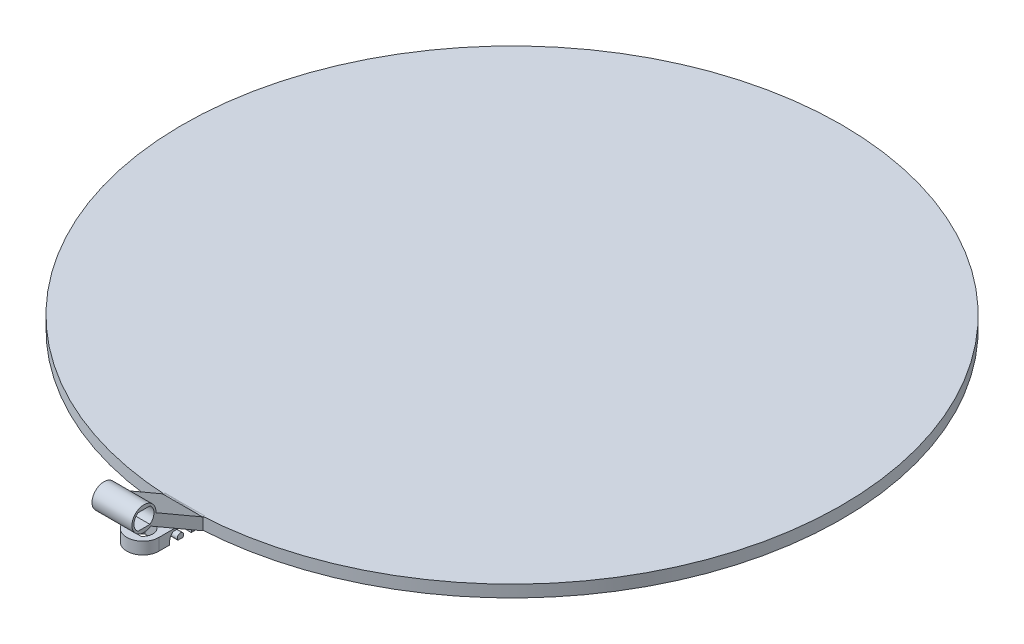
ISO-10303-21;
HEADER;
FILE_DESCRIPTION(('STEP AP214'),'2;1');
FILE_NAME('part.step','',(''),(''),'','','');
FILE_SCHEMA(('AUTOMOTIVE_DESIGN { 1 0 10303 214 1 1 1 1 }'));
ENDSEC;
DATA;
#1=APPLICATION_CONTEXT('core data for automotive mechanical design processes');
#2=APPLICATION_PROTOCOL_DEFINITION('international standard','automotive_design',2000,#1);
#3=PRODUCT_CONTEXT('',#1,'mechanical');
#4=PRODUCT('Part','Part','',(#3));
#5=PRODUCT_RELATED_PRODUCT_CATEGORY('part','',(#4));
#6=PRODUCT_DEFINITION_FORMATION('','',#4);
#7=PRODUCT_DEFINITION_CONTEXT('part definition',#1,'design');
#8=PRODUCT_DEFINITION('design','',#6,#7);
#9=PRODUCT_DEFINITION_SHAPE('','',#8);
#10=(LENGTH_UNIT() NAMED_UNIT(*) SI_UNIT(.MILLI.,.METRE.));
#11=(NAMED_UNIT(*) PLANE_ANGLE_UNIT() SI_UNIT($,.RADIAN.));
#12=(NAMED_UNIT(*) SI_UNIT($,.STERADIAN.) SOLID_ANGLE_UNIT());
#13=UNCERTAINTY_MEASURE_WITH_UNIT(LENGTH_MEASURE(1.E-05),#10,'distance_accuracy_value','');
#14=(GEOMETRIC_REPRESENTATION_CONTEXT(3) GLOBAL_UNCERTAINTY_ASSIGNED_CONTEXT((#13)) GLOBAL_UNIT_ASSIGNED_CONTEXT((#10,
#11,#12)) REPRESENTATION_CONTEXT('',''));
#15=CARTESIAN_POINT('',(0.,0.,0.));
#16=DIRECTION('',(0.,0.,1.));
#17=DIRECTION('',(1.,0.,0.));
#18=AXIS2_PLACEMENT_3D('',#15,#16,#17);
#19=CARTESIAN_POINT('',(5.,0.,0.));
#20=DIRECTION('',(1.,0.,0.));
#21=DIRECTION('',(0.,0.,-1.));
#22=AXIS2_PLACEMENT_3D('',#19,#20,#21);
#23=PLANE('',#22);
#24=DIRECTION('',(0.,0.5,0.866025403784439));
#25=VECTOR('',#24,1.);
#26=CARTESIAN_POINT('',(5.,-33.4735479061081,19.3259618943234));
#27=LINE('',#26,#25);
#28=CARTESIAN_POINT('',(5.,2.99999999999999,82.5));
#29=VERTEX_POINT('',#28);
#30=CARTESIAN_POINT('',(5.,9.72291827170098,94.1444360217193));
#31=VERTEX_POINT('',#30);
#32=EDGE_CURVE('E165',#29,#31,#27,.T.);
#33=ORIENTED_EDGE('',*,*,#32,.T.);
#34=CARTESIAN_POINT('',(5.,9.95,97.135829323957));
#35=DIRECTION('',(1.,0.,0.));
#36=DIRECTION('',(0.,0.,-1.));
#37=AXIS2_PLACEMENT_3D('',#34,#35,#36);
#38=CIRCLE('',#37,3.00000000000001);
#39=CARTESIAN_POINT('',(5.,7.472918271701,95.4434741273959));
#40=VERTEX_POINT('',#39);
#41=EDGE_CURVE('E109',#31,#40,#38,.T.);
#42=ORIENTED_EDGE('',*,*,#41,.T.);
#43=DIRECTION('',(0.,0.500000000000001,0.866025403784438));
#44=VECTOR('',#43,1.);
#45=CARTESIAN_POINT('',(5.,-35.7235479061081,20.6250000000001));
#46=LINE('',#45,#44);
#47=CARTESIAN_POINT('',(5.,0.,82.5));
#48=VERTEX_POINT('',#47);
#49=EDGE_CURVE('E142',#48,#40,#46,.T.);
#50=ORIENTED_EDGE('',*,*,#49,.F.);
#51=DIRECTION('',(0.,0.,1.));
#52=VECTOR('',#51,1.);
#53=CARTESIAN_POINT('',(5.,0.,0.));
#54=LINE('',#53,#52);
#55=CARTESIAN_POINT('',(5.,0.,82.0122848998968));
#56=VERTEX_POINT('',#55);
#57=EDGE_CURVE('E125',#56,#48,#54,.T.);
#58=ORIENTED_EDGE('',*,*,#57,.F.);
#59=DIRECTION('',(0.,-1.,0.));
#60=VECTOR('',#59,1.);
#61=CARTESIAN_POINT('',(5.,0.,82.0122848998968));
#62=LINE('',#61,#60);
#63=CARTESIAN_POINT('',(5.,3.,82.0122848998968));
#64=VERTEX_POINT('',#63);
#65=EDGE_CURVE('E140',#64,#56,#62,.T.);
#66=ORIENTED_EDGE('',*,*,#65,.F.);
#67=DIRECTION('',(0.,0.,-1.));
#68=VECTOR('',#67,1.);
#69=CARTESIAN_POINT('',(5.,3.,0.));
#70=LINE('',#69,#68);
#71=EDGE_CURVE('E145',#29,#64,#70,.T.);
#72=ORIENTED_EDGE('',*,*,#71,.F.);
#73=EDGE_LOOP('',(#33,#42,#50,#58,#66,#72));
#74=FACE_BOUND('',#73,.T.);
#75=CARTESIAN_POINT('',(5.,9.95,97.135829323957));
#76=DIRECTION('',(1.,0.,0.));
#77=DIRECTION('',(0.,0.,-1.));
#78=AXIS2_PLACEMENT_3D('',#75,#76,#77);
#79=CIRCLE('',#78,2.50000000000001);
#80=CARTESIAN_POINT('',(5.,11.95,98.635829323957));
#81=VERTEX_POINT('',#80);
#82=CARTESIAN_POINT('',(5.,7.95,98.635829323957));
#83=VERTEX_POINT('',#82);
#84=EDGE_CURVE('E320',#81,#83,#79,.T.);
#85=ORIENTED_EDGE('',*,*,#84,.F.);
#86=DIRECTION('',(0.,0.,-1.));
#87=VECTOR('',#86,1.);
#88=CARTESIAN_POINT('',(5.,11.95,0.));
#89=LINE('',#88,#87);
#90=CARTESIAN_POINT('',(5.,11.95,95.635829323957));
#91=VERTEX_POINT('',#90);
#92=EDGE_CURVE('E67',#81,#91,#89,.T.);
#93=ORIENTED_EDGE('',*,*,#92,.T.);
#94=CARTESIAN_POINT('',(5.,7.95,95.635829323957));
#95=VERTEX_POINT('',#94);
#96=EDGE_CURVE('E312',#95,#91,#79,.T.);
#97=ORIENTED_EDGE('',*,*,#96,.F.);
#98=DIRECTION('',(0.,0.,-1.));
#99=VECTOR('',#98,1.);
#100=CARTESIAN_POINT('',(5.,7.95,0.));
#101=LINE('',#100,#99);
#102=EDGE_CURVE('E323',#83,#95,#101,.T.);
#103=ORIENTED_EDGE('',*,*,#102,.F.);
#104=EDGE_LOOP('',(#85,#93,#97,#103));
#105=FACE_BOUND('',#104,.T.);
#106=ADVANCED_FACE('F51',(#74,#105),#23,.T.);
#107=CARTESIAN_POINT('',(5.,-33.4735479061081,19.3259618943234));
#108=DIRECTION('',(0.,-0.866025403784438,0.5));
#109=DIRECTION('',(0.,-0.5,-0.866025403784438));
#110=AXIS2_PLACEMENT_3D('',#107,#108,#109);
#111=PLANE('',#110);
#112=DIRECTION('',(0.,0.5,0.866025403784439));
#113=VECTOR('',#112,1.);
#114=CARTESIAN_POINT('',(-5.,-33.4735479061081,19.3259618943234));
#115=LINE('',#114,#113);
#116=CARTESIAN_POINT('',(-5.,2.99999999999999,82.5));
#117=VERTEX_POINT('',#116);
#118=CARTESIAN_POINT('',(-5.,9.72291827170098,94.1444360217193));
#119=VERTEX_POINT('',#118);
#120=EDGE_CURVE('E150',#117,#119,#115,.T.);
#121=ORIENTED_EDGE('',*,*,#120,.T.);
#122=DIRECTION('',(-1.,0.,0.));
#123=VECTOR('',#122,1.);
#124=CARTESIAN_POINT('',(5.,9.72291827170098,94.1444360217193));
#125=LINE('',#124,#123);
#126=EDGE_CURVE('E12',#31,#119,#125,.T.);
#127=ORIENTED_EDGE('',*,*,#126,.F.);
#128=ORIENTED_EDGE('',*,*,#32,.F.);
#129=DIRECTION('',(-1.,0.,0.));
#130=VECTOR('',#129,1.);
#131=CARTESIAN_POINT('',(5.,2.99999999999999,82.5));
#132=LINE('',#131,#130);
#133=EDGE_CURVE('E76',#29,#117,#132,.T.);
#134=ORIENTED_EDGE('',*,*,#133,.T.);
#135=EDGE_LOOP('',(#121,#127,#128,#134));
#136=FACE_BOUND('',#135,.T.);
#137=ADVANCED_FACE('F53',(#136),#111,.F.);
#138=CARTESIAN_POINT('',(5.,9.95,97.135829323957));
#139=DIRECTION('',(-1.,0.,0.));
#140=DIRECTION('',(0.,0.,1.));
#141=AXIS2_PLACEMENT_3D('',#138,#139,#140);
#142=CYLINDRICAL_SURFACE('',#141,3.00000000000001);
#143=CARTESIAN_POINT('',(-5.,9.95,97.135829323957));
#144=DIRECTION('',(1.,0.,0.));
#145=DIRECTION('',(0.,0.,-1.));
#146=AXIS2_PLACEMENT_3D('',#143,#144,#145);
#147=CIRCLE('',#146,3.00000000000001);
#148=CARTESIAN_POINT('',(-5.,7.472918271701,95.4434741273959));
#149=VERTEX_POINT('',#148);
#150=EDGE_CURVE('E152',#119,#149,#147,.T.);
#151=ORIENTED_EDGE('',*,*,#150,.T.);
#152=DIRECTION('',(-1.,0.,0.));
#153=VECTOR('',#152,1.);
#154=CARTESIAN_POINT('',(5.,7.472918271701,95.4434741273959));
#155=LINE('',#154,#153);
#156=EDGE_CURVE('E60',#40,#149,#155,.T.);
#157=ORIENTED_EDGE('',*,*,#156,.F.);
#158=ORIENTED_EDGE('',*,*,#41,.F.);
#159=ORIENTED_EDGE('',*,*,#126,.T.);
#160=EDGE_LOOP('',(#151,#157,#158,#159));
#161=FACE_BOUND('',#160,.T.);
#162=ADVANCED_FACE('F172',(#161),#142,.T.);
#163=CARTESIAN_POINT('',(5.,-35.7235479061081,20.6250000000001));
#164=DIRECTION('',(0.,-0.866025403784438,0.500000000000001));
#165=DIRECTION('',(0.,-0.500000000000001,-0.866025403784438));
#166=AXIS2_PLACEMENT_3D('',#163,#164,#165);
#167=PLANE('',#166);
#168=DIRECTION('',(0.,0.500000000000001,0.866025403784438));
#169=VECTOR('',#168,1.);
#170=CARTESIAN_POINT('',(-5.,-35.7235479061081,20.6250000000001));
#171=LINE('',#170,#169);
#172=CARTESIAN_POINT('',(-5.,0.,82.5));
#173=VERTEX_POINT('',#172);
#174=EDGE_CURVE('E156',#173,#149,#171,.T.);
#175=ORIENTED_EDGE('',*,*,#174,.F.);
#176=DIRECTION('',(-1.,0.,0.));
#177=VECTOR('',#176,1.);
#178=CARTESIAN_POINT('',(5.,0.,82.5));
#179=LINE('',#178,#177);
#180=EDGE_CURVE('E132',#48,#173,#179,.T.);
#181=ORIENTED_EDGE('',*,*,#180,.F.);
#182=ORIENTED_EDGE('',*,*,#49,.T.);
#183=ORIENTED_EDGE('',*,*,#156,.T.);
#184=EDGE_LOOP('',(#175,#181,#182,#183));
#185=FACE_BOUND('',#184,.T.);
#186=ADVANCED_FACE('F171',(#185),#167,.T.);
#187=CARTESIAN_POINT('',(5.,0.,0.));
#188=DIRECTION('',(0.,-1.,0.));
#189=DIRECTION('',(0.,0.,-1.));
#190=AXIS2_PLACEMENT_3D('',#187,#188,#189);
#191=PLANE('',#190);
#192=DIRECTION('',(0.,0.,1.));
#193=VECTOR('',#192,1.);
#194=CARTESIAN_POINT('',(-5.,0.,0.));
#195=LINE('',#194,#193);
#196=CARTESIAN_POINT('',(-5.,0.,82.0122848998968));
#197=VERTEX_POINT('',#196);
#198=EDGE_CURVE('E127',#197,#173,#195,.T.);
#199=ORIENTED_EDGE('',*,*,#198,.F.);
#200=DIRECTION('',(-1.,0.,0.));
#201=VECTOR('',#200,1.);
#202=CARTESIAN_POINT('',(5.,0.,82.0122848998968));
#203=LINE('',#202,#201);
#204=EDGE_CURVE('E122',#56,#197,#203,.T.);
#205=ORIENTED_EDGE('',*,*,#204,.F.);
#206=ORIENTED_EDGE('',*,*,#57,.T.);
#207=ORIENTED_EDGE('',*,*,#180,.T.);
#208=EDGE_LOOP('',(#199,#205,#206,#207));
#209=FACE_BOUND('',#208,.T.);
#210=ADVANCED_FACE('F124',(#209),#191,.T.);
#211=CARTESIAN_POINT('',(5.,0.,82.0122848998968));
#212=DIRECTION('',(0.,0.,-1.));
#213=DIRECTION('',(-1.,0.,0.));
#214=AXIS2_PLACEMENT_3D('',#211,#212,#213);
#215=PLANE('',#214);
#216=DIRECTION('',(0.,-1.,0.));
#217=VECTOR('',#216,1.);
#218=CARTESIAN_POINT('',(-5.,0.,82.0122848998968));
#219=LINE('',#218,#217);
#220=CARTESIAN_POINT('',(-5.,3.,82.0122848998968));
#221=VERTEX_POINT('',#220);
#222=EDGE_CURVE('E160',#221,#197,#219,.T.);
#223=ORIENTED_EDGE('',*,*,#222,.F.);
#224=DIRECTION('',(-1.,0.,0.));
#225=VECTOR('',#224,1.);
#226=CARTESIAN_POINT('',(5.,3.,82.0122848998968));
#227=LINE('',#226,#225);
#228=EDGE_CURVE('E133',#64,#221,#227,.T.);
#229=ORIENTED_EDGE('',*,*,#228,.F.);
#230=ORIENTED_EDGE('',*,*,#65,.T.);
#231=ORIENTED_EDGE('',*,*,#204,.T.);
#232=EDGE_LOOP('',(#223,#229,#230,#231));
#233=FACE_BOUND('',#232,.T.);
#234=ADVANCED_FACE('F144',(#233),#215,.T.);
#235=CARTESIAN_POINT('',(5.,3.,0.));
#236=DIRECTION('',(0.,1.,0.));
#237=DIRECTION('',(0.,0.,1.));
#238=AXIS2_PLACEMENT_3D('',#235,#236,#237);
#239=PLANE('',#238);
#240=DIRECTION('',(0.,0.,-1.));
#241=VECTOR('',#240,1.);
#242=CARTESIAN_POINT('',(-5.,3.,0.));
#243=LINE('',#242,#241);
#244=EDGE_CURVE('E162',#117,#221,#243,.T.);
#245=ORIENTED_EDGE('',*,*,#244,.F.);
#246=ORIENTED_EDGE('',*,*,#133,.F.);
#247=ORIENTED_EDGE('',*,*,#71,.T.);
#248=ORIENTED_EDGE('',*,*,#228,.T.);
#249=EDGE_LOOP('',(#245,#246,#247,#248));
#250=FACE_BOUND('',#249,.T.);
#251=ADVANCED_FACE('F176',(#250),#239,.T.);
#252=CARTESIAN_POINT('',(-5.,0.,0.));
#253=DIRECTION('',(1.,0.,0.));
#254=DIRECTION('',(0.,0.,-1.));
#255=AXIS2_PLACEMENT_3D('',#252,#253,#254);
#256=PLANE('',#255);
#257=ORIENTED_EDGE('',*,*,#120,.F.);
#258=ORIENTED_EDGE('',*,*,#244,.T.);
#259=ORIENTED_EDGE('',*,*,#222,.T.);
#260=ORIENTED_EDGE('',*,*,#198,.T.);
#261=ORIENTED_EDGE('',*,*,#174,.T.);
#262=ORIENTED_EDGE('',*,*,#150,.F.);
#263=EDGE_LOOP('',(#257,#258,#259,#260,#261,#262));
#264=FACE_BOUND('',#263,.T.);
#265=ADVANCED_FACE('F175',(#264),#256,.F.);
#266=CARTESIAN_POINT('',(-3.,11.95,0.));
#267=DIRECTION('',(0.,-1.,0.));
#268=DIRECTION('',(0.,0.,-1.));
#269=AXIS2_PLACEMENT_3D('',#266,#267,#268);
#270=PLANE('',#269);
#271=ORIENTED_EDGE('',*,*,#92,.F.);
#272=DIRECTION('',(1.,0.,0.));
#273=VECTOR('',#272,1.);
#274=CARTESIAN_POINT('',(-3.,11.95,98.635829323957));
#275=LINE('',#274,#273);
#276=CARTESIAN_POINT('',(-3.,11.95,98.635829323957));
#277=VERTEX_POINT('',#276);
#278=EDGE_CURVE('E333',#277,#81,#275,.T.);
#279=ORIENTED_EDGE('',*,*,#278,.F.);
#280=DIRECTION('',(0.,0.,-1.));
#281=VECTOR('',#280,1.);
#282=CARTESIAN_POINT('',(-3.,11.95,0.));
#283=LINE('',#282,#281);
#284=CARTESIAN_POINT('',(-3.,11.95,95.635829323957));
#285=VERTEX_POINT('',#284);
#286=EDGE_CURVE('E308',#277,#285,#283,.T.);
#287=ORIENTED_EDGE('',*,*,#286,.T.);
#288=DIRECTION('',(1.,0.,0.));
#289=VECTOR('',#288,1.);
#290=CARTESIAN_POINT('',(-3.,11.95,95.635829323957));
#291=LINE('',#290,#289);
#292=EDGE_CURVE('E153',#285,#91,#291,.T.);
#293=ORIENTED_EDGE('',*,*,#292,.T.);
#294=EDGE_LOOP('',(#271,#279,#287,#293));
#295=FACE_BOUND('',#294,.T.);
#296=ADVANCED_FACE('F190',(#295),#270,.T.);
#297=CARTESIAN_POINT('',(-3.,9.95,97.135829323957));
#298=DIRECTION('',(1.,0.,0.));
#299=DIRECTION('',(0.,0.,-1.));
#300=AXIS2_PLACEMENT_3D('',#297,#298,#299);
#301=CYLINDRICAL_SURFACE('',#300,2.50000000000001);
#302=ORIENTED_EDGE('',*,*,#96,.T.);
#303=ORIENTED_EDGE('',*,*,#292,.F.);
#304=CARTESIAN_POINT('',(-3.,9.95,97.135829323957));
#305=DIRECTION('',(1.,0.,0.));
#306=DIRECTION('',(0.,0.,-1.));
#307=AXIS2_PLACEMENT_3D('',#304,#305,#306);
#308=CIRCLE('',#307,2.50000000000001);
#309=CARTESIAN_POINT('',(-3.,7.95,95.635829323957));
#310=VERTEX_POINT('',#309);
#311=EDGE_CURVE('E316',#310,#285,#308,.T.);
#312=ORIENTED_EDGE('',*,*,#311,.F.);
#313=DIRECTION('',(1.,0.,0.));
#314=VECTOR('',#313,1.);
#315=CARTESIAN_POINT('',(-3.,7.95,95.635829323957));
#316=LINE('',#315,#314);
#317=EDGE_CURVE('E327',#310,#95,#316,.T.);
#318=ORIENTED_EDGE('',*,*,#317,.T.);
#319=EDGE_LOOP('',(#302,#303,#312,#318));
#320=FACE_BOUND('',#319,.T.);
#321=ADVANCED_FACE('F242',(#320),#301,.F.);
#322=CARTESIAN_POINT('',(-3.,7.95,0.));
#323=DIRECTION('',(0.,-1.,0.));
#324=DIRECTION('',(0.,0.,-1.));
#325=AXIS2_PLACEMENT_3D('',#322,#323,#324);
#326=PLANE('',#325);
#327=ORIENTED_EDGE('',*,*,#102,.T.);
#328=ORIENTED_EDGE('',*,*,#317,.F.);
#329=DIRECTION('',(0.,0.,-1.));
#330=VECTOR('',#329,1.);
#331=CARTESIAN_POINT('',(-3.,7.95,0.));
#332=LINE('',#331,#330);
#333=CARTESIAN_POINT('',(-3.,7.95,98.635829323957));
#334=VERTEX_POINT('',#333);
#335=EDGE_CURVE('E315',#334,#310,#332,.T.);
#336=ORIENTED_EDGE('',*,*,#335,.F.);
#337=DIRECTION('',(1.,0.,0.));
#338=VECTOR('',#337,1.);
#339=CARTESIAN_POINT('',(-3.,7.95,98.635829323957));
#340=LINE('',#339,#338);
#341=EDGE_CURVE('E330',#334,#83,#340,.T.);
#342=ORIENTED_EDGE('',*,*,#341,.T.);
#343=EDGE_LOOP('',(#327,#328,#336,#342));
#344=FACE_BOUND('',#343,.T.);
#345=ADVANCED_FACE('F250',(#344),#326,.F.);
#346=ORIENTED_EDGE('',*,*,#84,.T.);
#347=ORIENTED_EDGE('',*,*,#341,.F.);
#348=EDGE_CURVE('E311',#277,#334,#308,.T.);
#349=ORIENTED_EDGE('',*,*,#348,.F.);
#350=ORIENTED_EDGE('',*,*,#278,.T.);
#351=EDGE_LOOP('',(#346,#347,#349,#350));
#352=FACE_BOUND('',#351,.T.);
#353=ADVANCED_FACE('F253',(#352),#301,.F.);
#354=CARTESIAN_POINT('',(-3.,0.,0.));
#355=DIRECTION('',(1.,0.,0.));
#356=DIRECTION('',(0.,0.,-1.));
#357=AXIS2_PLACEMENT_3D('',#354,#355,#356);
#358=PLANE('',#357);
#359=CARTESIAN_POINT('',(-3.,9.95,97.135829323957));
#360=DIRECTION('',(1.,0.,0.));
#361=DIRECTION('',(0.,0.,-1.));
#362=AXIS2_PLACEMENT_3D('',#359,#360,#361);
#363=CIRCLE('',#362,0.999999999999998);
#364=CARTESIAN_POINT('',(-3.,9.95,96.135829323957));
#365=VERTEX_POINT('',#364);
#366=EDGE_CURVE('E55',#365,#365,#363,.F.);
#367=ORIENTED_EDGE('',*,*,#366,.T.);
#368=EDGE_LOOP('',(#367));
#369=FACE_BOUND('',#368,.T.);
#370=ORIENTED_EDGE('',*,*,#286,.F.);
#371=ORIENTED_EDGE('',*,*,#348,.T.);
#372=ORIENTED_EDGE('',*,*,#335,.T.);
#373=ORIENTED_EDGE('',*,*,#311,.T.);
#374=EDGE_LOOP('',(#370,#371,#372,#373));
#375=FACE_BOUND('',#374,.T.);
#376=ADVANCED_FACE('F269',(#369,#375),#358,.T.);
#377=CARTESIAN_POINT('',(-2.,9.95,97.135829323957));
#378=DIRECTION('',(-1.,0.,0.));
#379=DIRECTION('',(0.,0.,1.));
#380=AXIS2_PLACEMENT_3D('',#377,#378,#379);
#381=CYLINDRICAL_SURFACE('',#380,0.999999999999998);
#382=ORIENTED_EDGE('',*,*,#366,.F.);
#383=EDGE_LOOP('',(#382));
#384=FACE_BOUND('',#383,.T.);
#385=CARTESIAN_POINT('',(-2.,9.95,97.135829323957));
#386=DIRECTION('',(1.,0.,0.));
#387=DIRECTION('',(0.,0.,-1.));
#388=AXIS2_PLACEMENT_3D('',#385,#386,#387);
#389=CIRCLE('',#388,0.999999999999998);
#390=CARTESIAN_POINT('',(-2.,9.95,96.135829323957));
#391=VERTEX_POINT('',#390);
#392=EDGE_CURVE('E303',#391,#391,#389,.T.);
#393=ORIENTED_EDGE('',*,*,#392,.F.);
#394=EDGE_LOOP('',(#393));
#395=FACE_BOUND('',#394,.T.);
#396=ADVANCED_FACE('F278',(#384,#395),#381,.T.);
#397=CARTESIAN_POINT('',(-2.,9.95,97.135829323957));
#398=DIRECTION('',(1.,0.,0.));
#399=DIRECTION('',(0.,0.,-1.));
#400=AXIS2_PLACEMENT_3D('',#397,#398,#399);
#401=PLANE('',#400);
#402=ORIENTED_EDGE('',*,*,#392,.T.);
#403=EDGE_LOOP('',(#402));
#404=FACE_BOUND('',#403,.T.);
#405=ADVANCED_FACE('F288',(#404),#401,.T.);
#406=CLOSED_SHELL('',(#106,#137,#162,#186,#210,#234,#251,#265,#296,#321,#345,#353,#376,#396,#405));
#407=MANIFOLD_SOLID_BREP('B2',#406);
#408=CARTESIAN_POINT('',(0.,0.,0.));
#409=DIRECTION('',(0.,1.,0.));
#410=DIRECTION('',(0.,0.,1.));
#411=AXIS2_PLACEMENT_3D('',#408,#409,#410);
#412=PLANE('',#411);
#413=DIRECTION('',(-1.,0.,0.));
#414=VECTOR('',#413,1.);
#415=CARTESIAN_POINT('',(0.,0.,90.4029732473289));
#416=LINE('',#415,#414);
#417=CARTESIAN_POINT('',(1.50000000000002,0.,90.4029732473289));
#418=VERTEX_POINT('',#417);
#419=CARTESIAN_POINT('',(-1.50000000000002,0.,90.4029732473289));
#420=VERTEX_POINT('',#419);
#421=EDGE_CURVE('E556',#418,#420,#416,.T.);
#422=ORIENTED_EDGE('',*,*,#421,.T.);
#423=CARTESIAN_POINT('',(0.,0.,92.4029732473289));
#424=DIRECTION('',(0.,1.,0.));
#425=DIRECTION('',(0.,0.,1.));
#426=AXIS2_PLACEMENT_3D('',#423,#424,#425);
#427=CIRCLE('',#426,2.5);
#428=CARTESIAN_POINT('',(-1.5,0.,94.4029732473289));
#429=VERTEX_POINT('',#428);
#430=EDGE_CURVE('E566',#429,#420,#427,.F.);
#431=ORIENTED_EDGE('',*,*,#430,.F.);
#432=DIRECTION('',(-1.,0.,0.));
#433=VECTOR('',#432,1.);
#434=CARTESIAN_POINT('',(0.,0.,94.4029732473289));
#435=LINE('',#434,#433);
#436=CARTESIAN_POINT('',(1.5,0.,94.4029732473289));
#437=VERTEX_POINT('',#436);
#438=EDGE_CURVE('E570',#437,#429,#435,.T.);
#439=ORIENTED_EDGE('',*,*,#438,.F.);
#440=CARTESIAN_POINT('',(0.,0.,92.4029732473289));
#441=DIRECTION('',(0.,1.,0.));
#442=DIRECTION('',(0.,0.,1.));
#443=AXIS2_PLACEMENT_3D('',#440,#441,#442);
#444=CIRCLE('',#443,2.5);
#445=EDGE_CURVE('E531',#418,#437,#444,.F.);
#446=ORIENTED_EDGE('',*,*,#445,.F.);
#447=EDGE_LOOP('',(#422,#431,#439,#446));
#448=FACE_BOUND('',#447,.T.);
#449=DIRECTION('',(1.,0.,0.));
#450=VECTOR('',#449,1.);
#451=CARTESIAN_POINT('',(-10.,0.,88.4142135623731));
#452=LINE('',#451,#450);
#453=CARTESIAN_POINT('',(-2.,0.,88.4142135623731));
#454=VERTEX_POINT('',#453);
#455=CARTESIAN_POINT('',(-4.,0.,88.4142135623731));
#456=VERTEX_POINT('',#455);
#457=EDGE_CURVE('E390',#454,#456,#452,.F.);
#458=ORIENTED_EDGE('',*,*,#457,.F.);
#459=DIRECTION('',(0.,0.,1.));
#460=VECTOR('',#459,1.);
#461=CARTESIAN_POINT('',(-2.,0.,0.));
#462=LINE('',#461,#460);
#463=CARTESIAN_POINT('',(-2.,0.,85.5857864376269));
#464=VERTEX_POINT('',#463);
#465=EDGE_CURVE('E49',#464,#454,#462,.T.);
#466=ORIENTED_EDGE('',*,*,#465,.F.);
#467=DIRECTION('',(1.,0.,0.));
#468=VECTOR('',#467,1.);
#469=CARTESIAN_POINT('',(-10.,0.,85.5857864376269));
#470=LINE('',#469,#468);
#471=CARTESIAN_POINT('',(-4.,0.,85.5857864376269));
#472=VERTEX_POINT('',#471);
#473=EDGE_CURVE('E486',#472,#464,#470,.T.);
#474=ORIENTED_EDGE('',*,*,#473,.F.);
#475=DIRECTION('',(0.,0.,-1.));
#476=VECTOR('',#475,1.);
#477=CARTESIAN_POINT('',(-4.,0.,0.));
#478=LINE('',#477,#476);
#479=CARTESIAN_POINT('',(-4.00000000000016,0.,82.4029732473289));
#480=VERTEX_POINT('',#479);
#481=EDGE_CURVE('E536',#472,#480,#478,.T.);
#482=ORIENTED_EDGE('',*,*,#481,.T.);
#483=CARTESIAN_POINT('',(0.,0.,0.));
#484=DIRECTION('',(0.,1.,0.));
#485=DIRECTION('',(0.,0.,1.));
#486=AXIS2_PLACEMENT_3D('',#483,#484,#485);
#487=CIRCLE('',#486,82.5);
#488=CARTESIAN_POINT('',(4.,0.,82.4029732473289));
#489=VERTEX_POINT('',#488);
#490=EDGE_CURVE('E575',#489,#480,#487,.T.);
#491=ORIENTED_EDGE('',*,*,#490,.F.);
#492=DIRECTION('',(0.,0.,-1.));
#493=VECTOR('',#492,1.);
#494=CARTESIAN_POINT('',(4.,0.,0.));
#495=LINE('',#494,#493);
#496=CARTESIAN_POINT('',(4.,0.,84.295836543402));
#497=VERTEX_POINT('',#496);
#498=EDGE_CURVE('E559',#497,#489,#495,.T.);
#499=ORIENTED_EDGE('',*,*,#498,.F.);
#500=DIRECTION('',(1.,0.,0.));
#501=VECTOR('',#500,1.);
#502=CARTESIAN_POINT('',(0.,0.,84.295836543402));
#503=LINE('',#502,#501);
#504=CARTESIAN_POINT('',(0.,0.,84.295836543402));
#505=VERTEX_POINT('',#504);
#506=EDGE_CURVE('E524',#497,#505,#503,.F.);
#507=ORIENTED_EDGE('',*,*,#506,.T.);
#508=DIRECTION('',(0.,0.,-1.));
#509=VECTOR('',#508,1.);
#510=CARTESIAN_POINT('',(0.,0.,0.));
#511=LINE('',#510,#509);
#512=CARTESIAN_POINT('',(0.,0.,86.3755002001602));
#513=VERTEX_POINT('',#512);
#514=EDGE_CURVE('E599',#513,#505,#511,.T.);
#515=ORIENTED_EDGE('',*,*,#514,.F.);
#516=DIRECTION('',(1.,0.,0.));
#517=VECTOR('',#516,1.);
#518=CARTESIAN_POINT('',(0.,0.,86.3755002001602));
#519=LINE('',#518,#517);
#520=CARTESIAN_POINT('',(4.,0.,86.3755002001602));
#521=VERTEX_POINT('',#520);
#522=EDGE_CURVE('E520',#521,#513,#519,.F.);
#523=ORIENTED_EDGE('',*,*,#522,.F.);
#524=CARTESIAN_POINT('',(4.,0.,87.6244997998398));
#525=VERTEX_POINT('',#524);
#526=EDGE_CURVE('E583',#525,#521,#495,.T.);
#527=ORIENTED_EDGE('',*,*,#526,.F.);
#528=DIRECTION('',(1.,0.,0.));
#529=VECTOR('',#528,1.);
#530=CARTESIAN_POINT('',(0.,0.,87.6244997998398));
#531=LINE('',#530,#529);
#532=CARTESIAN_POINT('',(0.,0.,87.6244997998398));
#533=VERTEX_POINT('',#532);
#534=EDGE_CURVE('E522',#533,#525,#531,.T.);
#535=ORIENTED_EDGE('',*,*,#534,.F.);
#536=CARTESIAN_POINT('',(0.,0.,89.704163456598));
#537=VERTEX_POINT('',#536);
#538=EDGE_CURVE('E600',#537,#533,#511,.T.);
#539=ORIENTED_EDGE('',*,*,#538,.F.);
#540=DIRECTION('',(1.,0.,0.));
#541=VECTOR('',#540,1.);
#542=CARTESIAN_POINT('',(0.,0.,89.704163456598));
#543=LINE('',#542,#541);
#544=CARTESIAN_POINT('',(4.,0.,89.704163456598));
#545=VERTEX_POINT('',#544);
#546=EDGE_CURVE('E516',#537,#545,#543,.T.);
#547=ORIENTED_EDGE('',*,*,#546,.T.);
#548=CARTESIAN_POINT('',(4.,0.,92.4029732473289));
#549=VERTEX_POINT('',#548);
#550=EDGE_CURVE('E562',#549,#545,#495,.T.);
#551=ORIENTED_EDGE('',*,*,#550,.F.);
#552=CARTESIAN_POINT('',(0.,0.,92.4029732473289));
#553=DIRECTION('',(0.,1.,0.));
#554=DIRECTION('',(0.,0.,1.));
#555=AXIS2_PLACEMENT_3D('',#552,#553,#554);
#556=CIRCLE('',#555,4.);
#557=CARTESIAN_POINT('',(-4.,0.,92.4029732473289));
#558=VERTEX_POINT('',#557);
#559=EDGE_CURVE('E554',#549,#558,#556,.F.);
#560=ORIENTED_EDGE('',*,*,#559,.T.);
#561=EDGE_CURVE('E500',#558,#456,#478,.T.);
#562=ORIENTED_EDGE('',*,*,#561,.T.);
#563=EDGE_LOOP('',(#458,#466,#474,#482,#491,#499,#507,#515,#523,#527,#535,#539,#547,#551,#560,#562));
#564=FACE_BOUND('',#563,.T.);
#565=ADVANCED_FACE('F375',(#448,#564),#412,.F.);
#566=CARTESIAN_POINT('',(4.,-16.1245154965973,0.));
#567=DIRECTION('',(-1.,0.,0.));
#568=DIRECTION('',(0.,0.,1.));
#569=AXIS2_PLACEMENT_3D('',#566,#567,#568);
#570=PLANE('',#569);
#571=CARTESIAN_POINT('',(4.,0.5,87.));
#572=DIRECTION('',(-1.,0.,0.));
#573=DIRECTION('',(0.,0.,1.));
#574=AXIS2_PLACEMENT_3D('',#571,#572,#573);
#575=CIRCLE('',#574,0.799999999999995);
#576=EDGE_CURVE('E597',#525,#521,#575,.T.);
#577=ORIENTED_EDGE('',*,*,#576,.F.);
#578=ORIENTED_EDGE('',*,*,#526,.T.);
#579=EDGE_LOOP('',(#577,#578));
#580=FACE_BOUND('',#579,.T.);
#581=ADVANCED_FACE('F652',(#580),#570,.F.);
#582=CARTESIAN_POINT('',(0.,3.,0.));
#583=DIRECTION('',(0.,-1.,0.));
#584=DIRECTION('',(0.,0.,-1.));
#585=AXIS2_PLACEMENT_3D('',#582,#583,#584);
#586=CYLINDRICAL_SURFACE('',#585,82.5);
#587=ORIENTED_EDGE('',*,*,#490,.T.);
#588=DIRECTION('',(0.,1.,0.));
#589=VECTOR('',#588,1.);
#590=CARTESIAN_POINT('',(-4.00000000000016,-16.1245154965973,82.4029732473289));
#591=LINE('',#590,#589);
#592=CARTESIAN_POINT('',(-4.00000000000016,3.,82.4029732473289));
#593=VERTEX_POINT('',#592);
#594=EDGE_CURVE('E557',#480,#593,#591,.T.);
#595=ORIENTED_EDGE('',*,*,#594,.T.);
#596=CARTESIAN_POINT('',(0.,3.,0.));
#597=DIRECTION('',(0.,1.,0.));
#598=DIRECTION('',(0.,0.,1.));
#599=AXIS2_PLACEMENT_3D('',#596,#597,#598);
#600=CIRCLE('',#599,82.5);
#601=CARTESIAN_POINT('',(4.,3.,82.4029732473289));
#602=VERTEX_POINT('',#601);
#603=EDGE_CURVE('E584',#602,#593,#600,.T.);
#604=ORIENTED_EDGE('',*,*,#603,.F.);
#605=DIRECTION('',(0.,1.,0.));
#606=VECTOR('',#605,1.);
#607=CARTESIAN_POINT('',(4.00000000000016,-16.1245154965973,82.4029732473289));
#608=LINE('',#607,#606);
#609=EDGE_CURVE('E532',#489,#602,#608,.T.);
#610=ORIENTED_EDGE('',*,*,#609,.F.);
#611=EDGE_LOOP('',(#587,#595,#604,#610));
#612=FACE_BOUND('',#611,.T.);
#613=ADVANCED_FACE('F377',(#612),#586,.T.);
#614=CARTESIAN_POINT('',(0.,3.,0.));
#615=DIRECTION('',(0.,1.,0.));
#616=DIRECTION('',(0.,0.,1.));
#617=AXIS2_PLACEMENT_3D('',#614,#615,#616);
#618=PLANE('',#617);
#619=ORIENTED_EDGE('',*,*,#603,.T.);
#620=DIRECTION('',(0.,0.,1.));
#621=VECTOR('',#620,1.);
#622=CARTESIAN_POINT('',(-4.,3.,0.));
#623=LINE('',#622,#621);
#624=CARTESIAN_POINT('',(-4.,3.,92.4029732473289));
#625=VERTEX_POINT('',#624);
#626=EDGE_CURVE('E537',#593,#625,#623,.T.);
#627=ORIENTED_EDGE('',*,*,#626,.T.);
#628=CARTESIAN_POINT('',(0.,3.,92.4029732473289));
#629=DIRECTION('',(0.,1.,0.));
#630=DIRECTION('',(0.,0.,1.));
#631=AXIS2_PLACEMENT_3D('',#628,#629,#630);
#632=CIRCLE('',#631,4.);
#633=CARTESIAN_POINT('',(4.,3.,92.4029732473289));
#634=VERTEX_POINT('',#633);
#635=EDGE_CURVE('E533',#625,#634,#632,.T.);
#636=ORIENTED_EDGE('',*,*,#635,.T.);
#637=DIRECTION('',(0.,0.,1.));
#638=VECTOR('',#637,1.);
#639=CARTESIAN_POINT('',(4.,3.,0.));
#640=LINE('',#639,#638);
#641=EDGE_CURVE('E528',#602,#634,#640,.T.);
#642=ORIENTED_EDGE('',*,*,#641,.F.);
#643=EDGE_LOOP('',(#619,#627,#636,#642));
#644=FACE_BOUND('',#643,.T.);
#645=CARTESIAN_POINT('',(0.,3.,92.4029732473289));
#646=DIRECTION('',(0.,1.,0.));
#647=DIRECTION('',(0.,0.,1.));
#648=AXIS2_PLACEMENT_3D('',#645,#646,#647);
#649=CIRCLE('',#648,2.5);
#650=CARTESIAN_POINT('',(1.5,3.,94.4029732473289));
#651=VERTEX_POINT('',#650);
#652=CARTESIAN_POINT('',(1.50000000000002,3.,90.4029732473289));
#653=VERTEX_POINT('',#652);
#654=EDGE_CURVE('E548',#651,#653,#649,.T.);
#655=ORIENTED_EDGE('',*,*,#654,.F.);
#656=DIRECTION('',(1.,0.,0.));
#657=VECTOR('',#656,1.);
#658=CARTESIAN_POINT('',(0.,3.,94.4029732473289));
#659=LINE('',#658,#657);
#660=CARTESIAN_POINT('',(-1.5,3.,94.4029732473289));
#661=VERTEX_POINT('',#660);
#662=EDGE_CURVE('E544',#661,#651,#659,.T.);
#663=ORIENTED_EDGE('',*,*,#662,.F.);
#664=CARTESIAN_POINT('',(-1.50000000000002,3.,90.4029732473289));
#665=VERTEX_POINT('',#664);
#666=EDGE_CURVE('E553',#665,#661,#649,.T.);
#667=ORIENTED_EDGE('',*,*,#666,.F.);
#668=DIRECTION('',(1.,0.,0.));
#669=VECTOR('',#668,1.);
#670=CARTESIAN_POINT('',(0.,3.,90.4029732473289));
#671=LINE('',#670,#669);
#672=EDGE_CURVE('E540',#665,#653,#671,.T.);
#673=ORIENTED_EDGE('',*,*,#672,.T.);
#674=EDGE_LOOP('',(#655,#663,#667,#673));
#675=FACE_BOUND('',#674,.T.);
#676=ADVANCED_FACE('F627',(#644,#675),#618,.T.);
#677=CARTESIAN_POINT('',(-4.,-16.1245154965973,0.));
#678=DIRECTION('',(-1.,0.,0.));
#679=DIRECTION('',(0.,0.,1.));
#680=AXIS2_PLACEMENT_3D('',#677,#678,#679);
#681=PLANE('',#680);
#682=ORIENTED_EDGE('',*,*,#481,.F.);
#683=CARTESIAN_POINT('',(-4.,0.5,87.));
#684=DIRECTION('',(-1.,0.,0.));
#685=DIRECTION('',(0.,0.,1.));
#686=AXIS2_PLACEMENT_3D('',#683,#684,#685);
#687=CIRCLE('',#686,1.5);
#688=EDGE_CURVE('E383',#472,#456,#687,.F.);
#689=ORIENTED_EDGE('',*,*,#688,.T.);
#690=ORIENTED_EDGE('',*,*,#561,.F.);
#691=DIRECTION('',(0.,1.,0.));
#692=VECTOR('',#691,1.);
#693=CARTESIAN_POINT('',(-4.,-16.1245154965973,92.4029732473289));
#694=LINE('',#693,#692);
#695=EDGE_CURVE('E527',#558,#625,#694,.T.);
#696=ORIENTED_EDGE('',*,*,#695,.T.);
#697=ORIENTED_EDGE('',*,*,#626,.F.);
#698=ORIENTED_EDGE('',*,*,#594,.F.);
#699=EDGE_LOOP('',(#682,#689,#690,#696,#697,#698));
#700=FACE_BOUND('',#699,.T.);
#701=ADVANCED_FACE('F629',(#700),#681,.T.);
#702=DIRECTION('',(0.,0.,1.));
#703=VECTOR('',#702,1.);
#704=CARTESIAN_POINT('',(4.,2.50000000000001,0.));
#705=LINE('',#704,#703);
#706=CARTESIAN_POINT('',(4.,2.5,85.1125413911823));
#707=VERTEX_POINT('',#706);
#708=CARTESIAN_POINT('',(4.,2.50000000000001,88.8874586088177));
#709=VERTEX_POINT('',#708);
#710=EDGE_CURVE('E592',#707,#709,#705,.T.);
#711=ORIENTED_EDGE('',*,*,#710,.F.);
#712=CARTESIAN_POINT('',(4.,0.5,87.));
#713=DIRECTION('',(-1.,0.,0.));
#714=DIRECTION('',(0.,0.,1.));
#715=AXIS2_PLACEMENT_3D('',#712,#713,#714);
#716=CIRCLE('',#715,2.75000000000001);
#717=EDGE_CURVE('E594',#707,#497,#716,.T.);
#718=ORIENTED_EDGE('',*,*,#717,.T.);
#719=ORIENTED_EDGE('',*,*,#498,.T.);
#720=ORIENTED_EDGE('',*,*,#609,.T.);
#721=ORIENTED_EDGE('',*,*,#641,.T.);
#722=DIRECTION('',(0.,1.,0.));
#723=VECTOR('',#722,1.);
#724=CARTESIAN_POINT('',(4.,-16.1245154965973,92.4029732473289));
#725=LINE('',#724,#723);
#726=EDGE_CURVE('E543',#549,#634,#725,.T.);
#727=ORIENTED_EDGE('',*,*,#726,.F.);
#728=ORIENTED_EDGE('',*,*,#550,.T.);
#729=CARTESIAN_POINT('',(4.,0.5,87.));
#730=DIRECTION('',(-1.,0.,0.));
#731=DIRECTION('',(0.,0.,1.));
#732=AXIS2_PLACEMENT_3D('',#729,#730,#731);
#733=CIRCLE('',#732,2.75000000000001);
#734=EDGE_CURVE('E587',#545,#709,#733,.T.);
#735=ORIENTED_EDGE('',*,*,#734,.T.);
#736=EDGE_LOOP('',(#711,#718,#719,#720,#721,#727,#728,#735));
#737=FACE_BOUND('',#736,.T.);
#738=ADVANCED_FACE('F620',(#737),#570,.F.);
#739=CARTESIAN_POINT('',(0.,-16.1245154965973,92.4029732473289));
#740=DIRECTION('',(0.,1.,0.));
#741=DIRECTION('',(0.,0.,1.));
#742=AXIS2_PLACEMENT_3D('',#739,#740,#741);
#743=CYLINDRICAL_SURFACE('',#742,2.5);
#744=DIRECTION('',(0.,1.,0.));
#745=VECTOR('',#744,1.);
#746=CARTESIAN_POINT('',(1.50000000000002,-16.1245154965973,90.4029732473289));
#747=LINE('',#746,#745);
#748=EDGE_CURVE('E551',#418,#653,#747,.T.);
#749=ORIENTED_EDGE('',*,*,#748,.F.);
#750=ORIENTED_EDGE('',*,*,#445,.T.);
#751=DIRECTION('',(0.,1.,0.));
#752=VECTOR('',#751,1.);
#753=CARTESIAN_POINT('',(1.5,-16.1245154965973,94.4029732473289));
#754=LINE('',#753,#752);
#755=EDGE_CURVE('E552',#437,#651,#754,.T.);
#756=ORIENTED_EDGE('',*,*,#755,.T.);
#757=ORIENTED_EDGE('',*,*,#654,.T.);
#758=EDGE_LOOP('',(#749,#750,#756,#757));
#759=FACE_BOUND('',#758,.T.);
#760=ADVANCED_FACE('F664',(#759),#743,.F.);
#761=CARTESIAN_POINT('',(0.,-16.1245154965973,90.4029732473289));
#762=DIRECTION('',(0.,0.,1.));
#763=DIRECTION('',(1.,0.,0.));
#764=AXIS2_PLACEMENT_3D('',#761,#762,#763);
#765=PLANE('',#764);
#766=ORIENTED_EDGE('',*,*,#421,.F.);
#767=ORIENTED_EDGE('',*,*,#748,.T.);
#768=ORIENTED_EDGE('',*,*,#672,.F.);
#769=DIRECTION('',(0.,1.,0.));
#770=VECTOR('',#769,1.);
#771=CARTESIAN_POINT('',(-1.50000000000002,-16.1245154965973,90.4029732473289));
#772=LINE('',#771,#770);
#773=EDGE_CURVE('E567',#420,#665,#772,.T.);
#774=ORIENTED_EDGE('',*,*,#773,.F.);
#775=EDGE_LOOP('',(#766,#767,#768,#774));
#776=FACE_BOUND('',#775,.T.);
#777=ADVANCED_FACE('F668',(#776),#765,.T.);
#778=DIRECTION('',(0.,1.,0.));
#779=VECTOR('',#778,1.);
#780=CARTESIAN_POINT('',(-1.5,-16.1245154965973,94.4029732473289));
#781=LINE('',#780,#779);
#782=EDGE_CURVE('E547',#429,#661,#781,.T.);
#783=ORIENTED_EDGE('',*,*,#782,.F.);
#784=ORIENTED_EDGE('',*,*,#430,.T.);
#785=ORIENTED_EDGE('',*,*,#773,.T.);
#786=ORIENTED_EDGE('',*,*,#666,.T.);
#787=EDGE_LOOP('',(#783,#784,#785,#786));
#788=FACE_BOUND('',#787,.T.);
#789=ADVANCED_FACE('F671',(#788),#743,.F.);
#790=CARTESIAN_POINT('',(0.,-16.1245154965973,94.4029732473289));
#791=DIRECTION('',(0.,0.,1.));
#792=DIRECTION('',(1.,0.,0.));
#793=AXIS2_PLACEMENT_3D('',#790,#791,#792);
#794=PLANE('',#793);
#795=ORIENTED_EDGE('',*,*,#755,.F.);
#796=ORIENTED_EDGE('',*,*,#438,.T.);
#797=ORIENTED_EDGE('',*,*,#782,.T.);
#798=ORIENTED_EDGE('',*,*,#662,.T.);
#799=EDGE_LOOP('',(#795,#796,#797,#798));
#800=FACE_BOUND('',#799,.T.);
#801=ADVANCED_FACE('F667',(#800),#794,.F.);
#802=CARTESIAN_POINT('',(0.,-16.1245154965973,92.4029732473289));
#803=DIRECTION('',(0.,1.,0.));
#804=DIRECTION('',(0.,0.,1.));
#805=AXIS2_PLACEMENT_3D('',#802,#803,#804);
#806=CYLINDRICAL_SURFACE('',#805,4.);
#807=ORIENTED_EDGE('',*,*,#559,.F.);
#808=ORIENTED_EDGE('',*,*,#726,.T.);
#809=ORIENTED_EDGE('',*,*,#635,.F.);
#810=ORIENTED_EDGE('',*,*,#695,.F.);
#811=EDGE_LOOP('',(#807,#808,#809,#810));
#812=FACE_BOUND('',#811,.T.);
#813=ADVANCED_FACE('F634',(#812),#806,.T.);
#814=CARTESIAN_POINT('',(0.,0.,0.));
#815=DIRECTION('',(1.,0.,0.));
#816=DIRECTION('',(0.,0.,-1.));
#817=AXIS2_PLACEMENT_3D('',#814,#815,#816);
#818=PLANE('',#817);
#819=ORIENTED_EDGE('',*,*,#538,.T.);
#820=CARTESIAN_POINT('',(0.,0.5,87.));
#821=DIRECTION('',(1.,0.,0.));
#822=DIRECTION('',(0.,0.,-1.));
#823=AXIS2_PLACEMENT_3D('',#820,#821,#822);
#824=CIRCLE('',#823,0.799999999999995);
#825=EDGE_CURVE('E501',#513,#533,#824,.T.);
#826=ORIENTED_EDGE('',*,*,#825,.F.);
#827=ORIENTED_EDGE('',*,*,#514,.T.);
#828=CARTESIAN_POINT('',(0.,0.5,87.));
#829=DIRECTION('',(1.,0.,0.));
#830=DIRECTION('',(0.,0.,-1.));
#831=AXIS2_PLACEMENT_3D('',#828,#829,#830);
#832=CIRCLE('',#831,2.75000000000001);
#833=CARTESIAN_POINT('',(0.,2.5,85.1125413911823));
#834=VERTEX_POINT('',#833);
#835=EDGE_CURVE('E512',#505,#834,#832,.T.);
#836=ORIENTED_EDGE('',*,*,#835,.T.);
#837=DIRECTION('',(0.,0.,-1.));
#838=VECTOR('',#837,1.);
#839=CARTESIAN_POINT('',(0.,2.50000000000001,0.));
#840=LINE('',#839,#838);
#841=CARTESIAN_POINT('',(0.,2.5,88.8874586088177));
#842=VERTEX_POINT('',#841);
#843=EDGE_CURVE('E504',#842,#834,#840,.T.);
#844=ORIENTED_EDGE('',*,*,#843,.F.);
#845=EDGE_CURVE('E509',#842,#537,#832,.T.);
#846=ORIENTED_EDGE('',*,*,#845,.T.);
#847=EDGE_LOOP('',(#819,#826,#827,#836,#844,#846));
#848=FACE_BOUND('',#847,.T.);
#849=ADVANCED_FACE('F605',(#848),#818,.T.);
#850=CARTESIAN_POINT('',(0.,2.50000000000001,0.));
#851=DIRECTION('',(0.,-1.,0.));
#852=DIRECTION('',(0.,0.,-1.));
#853=AXIS2_PLACEMENT_3D('',#850,#851,#852);
#854=PLANE('',#853);
#855=ORIENTED_EDGE('',*,*,#710,.T.);
#856=DIRECTION('',(1.,0.,0.));
#857=VECTOR('',#856,1.);
#858=CARTESIAN_POINT('',(0.,2.5,88.8874586088177));
#859=LINE('',#858,#857);
#860=EDGE_CURVE('E398',#842,#709,#859,.T.);
#861=ORIENTED_EDGE('',*,*,#860,.F.);
#862=ORIENTED_EDGE('',*,*,#843,.T.);
#863=DIRECTION('',(1.,0.,0.));
#864=VECTOR('',#863,1.);
#865=CARTESIAN_POINT('',(0.,2.5,85.1125413911823));
#866=LINE('',#865,#864);
#867=EDGE_CURVE('E513',#834,#707,#866,.T.);
#868=ORIENTED_EDGE('',*,*,#867,.T.);
#869=EDGE_LOOP('',(#855,#861,#862,#868));
#870=FACE_BOUND('',#869,.T.);
#871=ADVANCED_FACE('F650',(#870),#854,.T.);
#872=CARTESIAN_POINT('',(0.,0.5,87.));
#873=DIRECTION('',(1.,0.,0.));
#874=DIRECTION('',(0.,0.,-1.));
#875=AXIS2_PLACEMENT_3D('',#872,#873,#874);
#876=CYLINDRICAL_SURFACE('',#875,2.75000000000001);
#877=ORIENTED_EDGE('',*,*,#717,.F.);
#878=ORIENTED_EDGE('',*,*,#867,.F.);
#879=ORIENTED_EDGE('',*,*,#835,.F.);
#880=ORIENTED_EDGE('',*,*,#506,.F.);
#881=EDGE_LOOP('',(#877,#878,#879,#880));
#882=FACE_BOUND('',#881,.T.);
#883=ADVANCED_FACE('F639',(#882),#876,.F.);
#884=CARTESIAN_POINT('',(0.,0.5,87.));
#885=DIRECTION('',(1.,0.,0.));
#886=DIRECTION('',(0.,0.,-1.));
#887=AXIS2_PLACEMENT_3D('',#884,#885,#886);
#888=CYLINDRICAL_SURFACE('',#887,0.799999999999995);
#889=ORIENTED_EDGE('',*,*,#534,.T.);
#890=ORIENTED_EDGE('',*,*,#576,.T.);
#891=ORIENTED_EDGE('',*,*,#522,.T.);
#892=ORIENTED_EDGE('',*,*,#825,.T.);
#893=EDGE_LOOP('',(#889,#890,#891,#892));
#894=FACE_BOUND('',#893,.T.);
#895=ADVANCED_FACE('F610',(#894),#888,.T.);
#896=ORIENTED_EDGE('',*,*,#845,.F.);
#897=ORIENTED_EDGE('',*,*,#860,.T.);
#898=ORIENTED_EDGE('',*,*,#734,.F.);
#899=ORIENTED_EDGE('',*,*,#546,.F.);
#900=EDGE_LOOP('',(#896,#897,#898,#899));
#901=FACE_BOUND('',#900,.T.);
#902=ADVANCED_FACE('F636',(#901),#876,.F.);
#903=CARTESIAN_POINT('',(-2.,0.5,87.));
#904=DIRECTION('',(-1.,0.,0.));
#905=DIRECTION('',(0.,0.,1.));
#906=AXIS2_PLACEMENT_3D('',#903,#904,#905);
#907=PLANE('',#906);
#908=CARTESIAN_POINT('',(-2.,0.5,87.));
#909=DIRECTION('',(-1.,0.,0.));
#910=DIRECTION('',(0.,0.,1.));
#911=AXIS2_PLACEMENT_3D('',#908,#909,#910);
#912=CIRCLE('',#911,1.5);
#913=EDGE_CURVE('E489',#464,#454,#912,.T.);
#914=ORIENTED_EDGE('',*,*,#913,.F.);
#915=ORIENTED_EDGE('',*,*,#465,.T.);
#916=EDGE_LOOP('',(#914,#915));
#917=FACE_BOUND('',#916,.T.);
#918=ADVANCED_FACE('F496',(#917),#907,.F.);
#919=CARTESIAN_POINT('',(-10.,0.5,87.));
#920=DIRECTION('',(1.,0.,0.));
#921=DIRECTION('',(0.,0.,-1.));
#922=AXIS2_PLACEMENT_3D('',#919,#920,#921);
#923=CYLINDRICAL_SURFACE('',#922,1.5);
#924=CARTESIAN_POINT('',(-10.,0.5,87.));
#925=DIRECTION('',(-1.,0.,0.));
#926=DIRECTION('',(0.,0.,1.));
#927=AXIS2_PLACEMENT_3D('',#924,#925,#926);
#928=CIRCLE('',#927,1.5);
#929=CARTESIAN_POINT('',(-10.,0.5,88.5));
#930=VERTEX_POINT('',#929);
#931=EDGE_CURVE('E493',#930,#930,#928,.T.);
#932=ORIENTED_EDGE('',*,*,#931,.F.);
#933=EDGE_LOOP('',(#932));
#934=FACE_BOUND('',#933,.T.);
#935=ORIENTED_EDGE('',*,*,#913,.T.);
#936=ORIENTED_EDGE('',*,*,#457,.T.);
#937=ORIENTED_EDGE('',*,*,#688,.F.);
#938=ORIENTED_EDGE('',*,*,#473,.T.);
#939=EDGE_LOOP('',(#935,#936,#937,#938));
#940=FACE_BOUND('',#939,.T.);
#941=ADVANCED_FACE('F488',(#934,#940),#923,.T.);
#942=CARTESIAN_POINT('',(-10.,0.5,87.));
#943=DIRECTION('',(-1.,0.,0.));
#944=DIRECTION('',(0.,0.,1.));
#945=AXIS2_PLACEMENT_3D('',#942,#943,#944);
#946=PLANE('',#945);
#947=ORIENTED_EDGE('',*,*,#931,.T.);
#948=EDGE_LOOP('',(#947));
#949=FACE_BOUND('',#948,.T.);
#950=ADVANCED_FACE('F689',(#949),#946,.T.);
#951=CLOSED_SHELL('',(#565,#581,#613,#676,#701,#738,#760,#777,#789,#801,#813,#849,#871,#883,
#895,#902,#918,#941,#950));
#952=MANIFOLD_SOLID_BREP('B6',#951);
#953=ADVANCED_BREP_SHAPE_REPRESENTATION('',(#18,#407,#952),#14);
#954=SHAPE_DEFINITION_REPRESENTATION(#9,#953);
ENDSEC;
END-ISO-10303-21;
